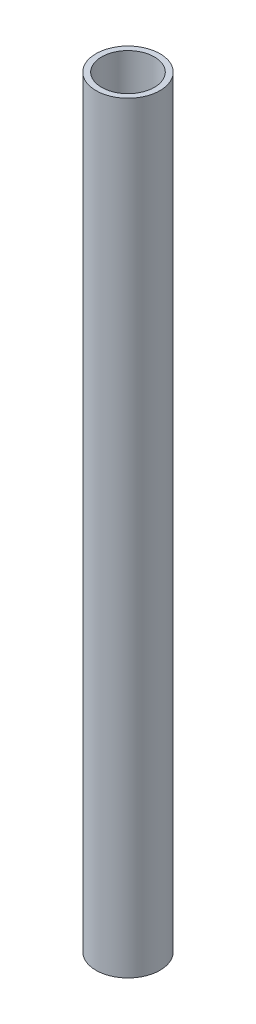
ISO-10303-21;
HEADER;
FILE_DESCRIPTION(('STEP AP214'),'2;1');
FILE_NAME('part.step','',(''),(''),'','','');
FILE_SCHEMA(('AUTOMOTIVE_DESIGN { 1 0 10303 214 1 1 1 1 }'));
ENDSEC;
DATA;
#1=APPLICATION_CONTEXT('core data for automotive mechanical design processes');
#2=APPLICATION_PROTOCOL_DEFINITION('international standard','automotive_design',2000,#1);
#3=PRODUCT_CONTEXT('',#1,'mechanical');
#4=PRODUCT('Part','Part','',(#3));
#5=PRODUCT_RELATED_PRODUCT_CATEGORY('part','',(#4));
#6=PRODUCT_DEFINITION_FORMATION('','',#4);
#7=PRODUCT_DEFINITION_CONTEXT('part definition',#1,'design');
#8=PRODUCT_DEFINITION('design','',#6,#7);
#9=PRODUCT_DEFINITION_SHAPE('','',#8);
#10=(LENGTH_UNIT() NAMED_UNIT(*) SI_UNIT(.MILLI.,.METRE.));
#11=(NAMED_UNIT(*) PLANE_ANGLE_UNIT() SI_UNIT($,.RADIAN.));
#12=(NAMED_UNIT(*) SI_UNIT($,.STERADIAN.) SOLID_ANGLE_UNIT());
#13=UNCERTAINTY_MEASURE_WITH_UNIT(LENGTH_MEASURE(1.E-05),#10,'distance_accuracy_value','');
#14=(GEOMETRIC_REPRESENTATION_CONTEXT(3) GLOBAL_UNCERTAINTY_ASSIGNED_CONTEXT((#13)) GLOBAL_UNIT_ASSIGNED_CONTEXT((#10,
#11,#12)) REPRESENTATION_CONTEXT('',''));
#15=CARTESIAN_POINT('',(0.,0.,0.));
#16=DIRECTION('',(0.,0.,1.));
#17=DIRECTION('',(1.,0.,0.));
#18=AXIS2_PLACEMENT_3D('',#15,#16,#17);
#19=CARTESIAN_POINT('',(0.,300.,0.));
#20=DIRECTION('',(0.,-1.,0.));
#21=DIRECTION('',(0.,0.,-1.));
#22=AXIS2_PLACEMENT_3D('',#19,#20,#21);
#23=CYLINDRICAL_SURFACE('',#22,12.6);
#24=CARTESIAN_POINT('',(0.,300.,0.));
#25=DIRECTION('',(0.,1.,0.));
#26=DIRECTION('',(0.,0.,1.));
#27=AXIS2_PLACEMENT_3D('',#24,#25,#26);
#28=CIRCLE('',#27,12.6);
#29=CARTESIAN_POINT('',(0.,300.,12.6));
#30=VERTEX_POINT('',#29);
#31=EDGE_CURVE('E10',#30,#30,#28,.T.);
#32=ORIENTED_EDGE('',*,*,#31,.F.);
#33=EDGE_LOOP('',(#32));
#34=FACE_BOUND('',#33,.T.);
#35=CARTESIAN_POINT('',(0.,0.,0.));
#36=DIRECTION('',(0.,1.,0.));
#37=DIRECTION('',(0.,0.,1.));
#38=AXIS2_PLACEMENT_3D('',#35,#36,#37);
#39=CIRCLE('',#38,12.6);
#40=CARTESIAN_POINT('',(0.,0.,12.6));
#41=VERTEX_POINT('',#40);
#42=EDGE_CURVE('E40',#41,#41,#39,.T.);
#43=ORIENTED_EDGE('',*,*,#42,.T.);
#44=EDGE_LOOP('',(#43));
#45=FACE_BOUND('',#44,.T.);
#46=ADVANCED_FACE('F37',(#34,#45),#23,.T.);
#47=CARTESIAN_POINT('',(0.,300.,0.));
#48=DIRECTION('',(0.,1.,0.));
#49=DIRECTION('',(0.,0.,1.));
#50=AXIS2_PLACEMENT_3D('',#47,#48,#49);
#51=PLANE('',#50);
#52=CARTESIAN_POINT('',(0.,300.,0.));
#53=DIRECTION('',(0.,1.,0.));
#54=DIRECTION('',(0.,0.,1.));
#55=AXIS2_PLACEMENT_3D('',#52,#53,#54);
#56=CIRCLE('',#55,10.4);
#57=CARTESIAN_POINT('',(0.,300.,10.4));
#58=VERTEX_POINT('',#57);
#59=EDGE_CURVE('E49',#58,#58,#56,.T.);
#60=ORIENTED_EDGE('',*,*,#59,.F.);
#61=EDGE_LOOP('',(#60));
#62=FACE_BOUND('',#61,.T.);
#63=ORIENTED_EDGE('',*,*,#31,.T.);
#64=EDGE_LOOP('',(#63));
#65=FACE_BOUND('',#64,.T.);
#66=ADVANCED_FACE('F62',(#62,#65),#51,.T.);
#67=CARTESIAN_POINT('',(0.,0.,0.));
#68=DIRECTION('',(0.,1.,0.));
#69=DIRECTION('',(0.,0.,1.));
#70=AXIS2_PLACEMENT_3D('',#67,#68,#69);
#71=PLANE('',#70);
#72=CARTESIAN_POINT('',(0.,0.,0.));
#73=DIRECTION('',(0.,1.,0.));
#74=DIRECTION('',(0.,0.,1.));
#75=AXIS2_PLACEMENT_3D('',#72,#73,#74);
#76=CIRCLE('',#75,10.4);
#77=CARTESIAN_POINT('',(0.,0.,10.4));
#78=VERTEX_POINT('',#77);
#79=EDGE_CURVE('E51',#78,#78,#76,.T.);
#80=ORIENTED_EDGE('',*,*,#79,.T.);
#81=EDGE_LOOP('',(#80));
#82=FACE_BOUND('',#81,.T.);
#83=ORIENTED_EDGE('',*,*,#42,.F.);
#84=EDGE_LOOP('',(#83));
#85=FACE_BOUND('',#84,.T.);
#86=ADVANCED_FACE('F64',(#82,#85),#71,.F.);
#87=CARTESIAN_POINT('',(0.,300.,0.));
#88=DIRECTION('',(0.,-1.,0.));
#89=DIRECTION('',(0.,0.,-1.));
#90=AXIS2_PLACEMENT_3D('',#87,#88,#89);
#91=CYLINDRICAL_SURFACE('',#90,10.4);
#92=ORIENTED_EDGE('',*,*,#59,.T.);
#93=EDGE_LOOP('',(#92));
#94=FACE_BOUND('',#93,.T.);
#95=ORIENTED_EDGE('',*,*,#79,.F.);
#96=EDGE_LOOP('',(#95));
#97=FACE_BOUND('',#96,.T.);
#98=ADVANCED_FACE('F59',(#94,#97),#91,.F.);
#99=CLOSED_SHELL('',(#46,#66,#86,#98));
#100=MANIFOLD_SOLID_BREP('B2',#99);
#101=ADVANCED_BREP_SHAPE_REPRESENTATION('',(#18,#100),#14);
#102=SHAPE_DEFINITION_REPRESENTATION(#9,#101);
ENDSEC;
END-ISO-10303-21;
